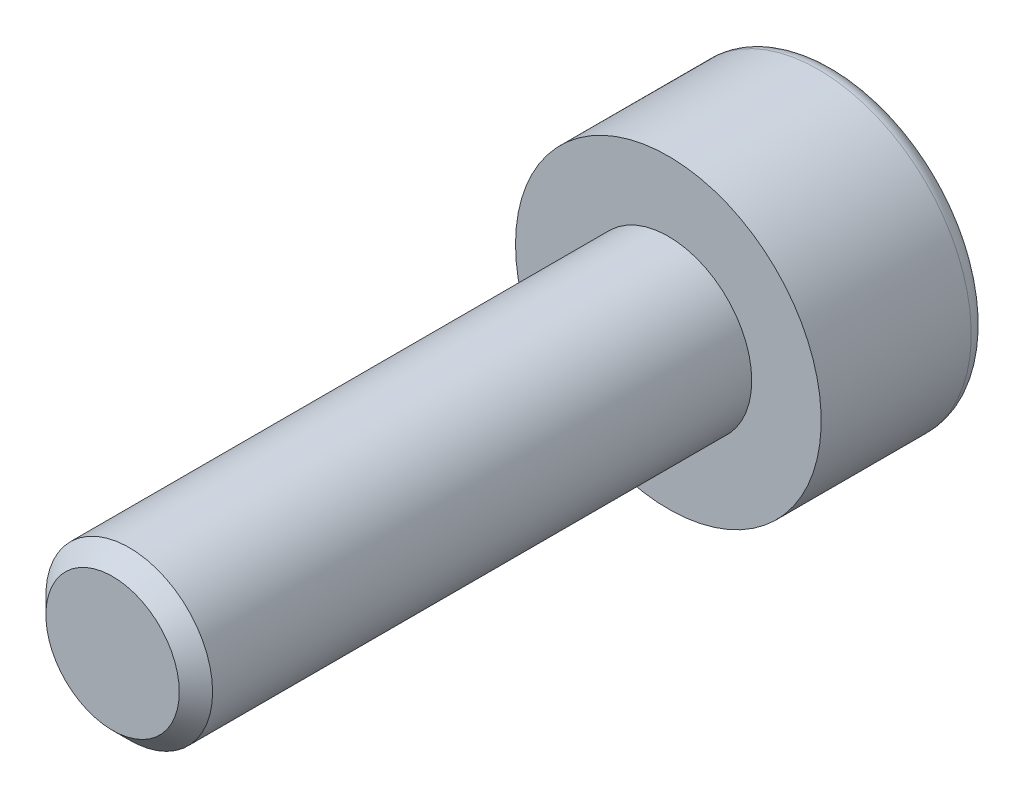
ISO-10303-21;
HEADER;
FILE_DESCRIPTION(('STEP AP214'),'2;1');
FILE_NAME('part.step','',(''),(''),'','','');
FILE_SCHEMA(('AUTOMOTIVE_DESIGN { 1 0 10303 214 1 1 1 1 }'));
ENDSEC;
DATA;
#1=APPLICATION_CONTEXT('core data for automotive mechanical design processes');
#2=APPLICATION_PROTOCOL_DEFINITION('international standard','automotive_design',2000,#1);
#3=PRODUCT_CONTEXT('',#1,'mechanical');
#4=PRODUCT('Part','Part','',(#3));
#5=PRODUCT_RELATED_PRODUCT_CATEGORY('part','',(#4));
#6=PRODUCT_DEFINITION_FORMATION('','',#4);
#7=PRODUCT_DEFINITION_CONTEXT('part definition',#1,'design');
#8=PRODUCT_DEFINITION('design','',#6,#7);
#9=PRODUCT_DEFINITION_SHAPE('','',#8);
#10=(LENGTH_UNIT() NAMED_UNIT(*) SI_UNIT(.MILLI.,.METRE.));
#11=(NAMED_UNIT(*) PLANE_ANGLE_UNIT() SI_UNIT($,.RADIAN.));
#12=(NAMED_UNIT(*) SI_UNIT($,.STERADIAN.) SOLID_ANGLE_UNIT());
#13=UNCERTAINTY_MEASURE_WITH_UNIT(LENGTH_MEASURE(1.E-05),#10,'distance_accuracy_value','');
#14=(GEOMETRIC_REPRESENTATION_CONTEXT(3) GLOBAL_UNCERTAINTY_ASSIGNED_CONTEXT((#13)) GLOBAL_UNIT_ASSIGNED_CONTEXT((#10,
#11,#12)) REPRESENTATION_CONTEXT('',''));
#15=CARTESIAN_POINT('',(0.,0.,0.));
#16=DIRECTION('',(0.,0.,1.));
#17=DIRECTION('',(1.,0.,0.));
#18=AXIS2_PLACEMENT_3D('',#15,#16,#17);
#19=CARTESIAN_POINT('',(0.,0.,-3.));
#20=DIRECTION('',(0.,0.,1.));
#21=DIRECTION('',(1.,0.,0.));
#22=AXIS2_PLACEMENT_3D('',#19,#20,#21);
#23=PLANE('',#22);
#24=CARTESIAN_POINT('',(0.,0.,-3.));
#25=DIRECTION('',(0.,0.,-1.));
#26=DIRECTION('',(-1.,0.,0.));
#27=AXIS2_PLACEMENT_3D('',#24,#25,#26);
#28=CIRCLE('',#27,2.45);
#29=CARTESIAN_POINT('',(-2.45,0.,-3.));
#30=VERTEX_POINT('',#29);
#31=EDGE_CURVE('E144',#30,#30,#28,.T.);
#32=ORIENTED_EDGE('',*,*,#31,.T.);
#33=EDGE_LOOP('',(#32));
#34=FACE_BOUND('',#33,.T.);
#35=DIRECTION('',(-0.86602540378444,0.499999999999998,0.));
#36=VECTOR('',#35,1.);
#37=CARTESIAN_POINT('',(0.,1.73205080756888,-3.));
#38=LINE('',#37,#36);
#39=CARTESIAN_POINT('',(1.5,0.866025403784442,-3.));
#40=VERTEX_POINT('',#39);
#41=CARTESIAN_POINT('',(0.,1.73205080756888,-3.));
#42=VERTEX_POINT('',#41);
#43=EDGE_CURVE('E46',#40,#42,#38,.T.);
#44=ORIENTED_EDGE('',*,*,#43,.T.);
#45=DIRECTION('',(-0.866025403784438,-0.500000000000001,0.));
#46=VECTOR('',#45,1.);
#47=CARTESIAN_POINT('',(0.,1.73205080756888,-3.));
#48=LINE('',#47,#46);
#49=CARTESIAN_POINT('',(-1.5,0.866025403784441,-3.));
#50=VERTEX_POINT('',#49);
#51=EDGE_CURVE('E117',#42,#50,#48,.T.);
#52=ORIENTED_EDGE('',*,*,#51,.T.);
#53=DIRECTION('',(0.,-1.,0.));
#54=VECTOR('',#53,1.);
#55=CARTESIAN_POINT('',(-1.5,-0.866025403784441,-3.));
#56=LINE('',#55,#54);
#57=CARTESIAN_POINT('',(-1.5,-0.866025403784441,-3.));
#58=VERTEX_POINT('',#57);
#59=EDGE_CURVE('E121',#50,#58,#56,.T.);
#60=ORIENTED_EDGE('',*,*,#59,.T.);
#61=DIRECTION('',(0.866025403784438,-0.500000000000001,0.));
#62=VECTOR('',#61,1.);
#63=CARTESIAN_POINT('',(0.,-1.73205080756888,-3.));
#64=LINE('',#63,#62);
#65=CARTESIAN_POINT('',(0.,-1.73205080756888,-3.));
#66=VERTEX_POINT('',#65);
#67=EDGE_CURVE('E124',#58,#66,#64,.T.);
#68=ORIENTED_EDGE('',*,*,#67,.T.);
#69=DIRECTION('',(0.86602540378444,0.499999999999998,0.));
#70=VECTOR('',#69,1.);
#71=CARTESIAN_POINT('',(0.,-1.73205080756888,-3.));
#72=LINE('',#71,#70);
#73=CARTESIAN_POINT('',(1.5,-0.866025403784441,-3.));
#74=VERTEX_POINT('',#73);
#75=EDGE_CURVE('E107',#66,#74,#72,.T.);
#76=ORIENTED_EDGE('',*,*,#75,.T.);
#77=DIRECTION('',(0.,1.,0.));
#78=VECTOR('',#77,1.);
#79=CARTESIAN_POINT('',(1.5,-0.866025403784441,-3.));
#80=LINE('',#79,#78);
#81=EDGE_CURVE('E127',#74,#40,#80,.T.);
#82=ORIENTED_EDGE('',*,*,#81,.T.);
#83=EDGE_LOOP('',(#44,#52,#60,#68,#76,#82));
#84=FACE_BOUND('',#83,.T.);
#85=ADVANCED_FACE('F31',(#34,#84),#23,.F.);
#86=CARTESIAN_POINT('',(0.,0.,-2.7));
#87=DIRECTION('',(0.,0.,-1.));
#88=DIRECTION('',(-1.,0.,0.));
#89=AXIS2_PLACEMENT_3D('',#86,#87,#88);
#90=TOROIDAL_SURFACE('',#89,2.45,0.3);
#91=ORIENTED_EDGE('',*,*,#31,.F.);
#92=EDGE_LOOP('',(#91));
#93=FACE_BOUND('',#92,.T.);
#94=CARTESIAN_POINT('',(0.,0.,-2.7));
#95=DIRECTION('',(0.,0.,-1.));
#96=DIRECTION('',(-1.,0.,0.));
#97=AXIS2_PLACEMENT_3D('',#94,#95,#96);
#98=CIRCLE('',#97,2.75);
#99=CARTESIAN_POINT('',(-2.75,0.,-2.7));
#100=VERTEX_POINT('',#99);
#101=EDGE_CURVE('E141',#100,#100,#98,.T.);
#102=ORIENTED_EDGE('',*,*,#101,.T.);
#103=EDGE_LOOP('',(#102));
#104=FACE_BOUND('',#103,.T.);
#105=ADVANCED_FACE('F161',(#93,#104),#90,.T.);
#106=CARTESIAN_POINT('',(0.,0.,0.));
#107=DIRECTION('',(0.,0.,-1.));
#108=DIRECTION('',(-1.,0.,0.));
#109=AXIS2_PLACEMENT_3D('',#106,#107,#108);
#110=CYLINDRICAL_SURFACE('',#109,2.75);
#111=ORIENTED_EDGE('',*,*,#101,.F.);
#112=EDGE_LOOP('',(#111));
#113=FACE_BOUND('',#112,.T.);
#114=CARTESIAN_POINT('',(0.,0.,0.));
#115=DIRECTION('',(0.,0.,-1.));
#116=DIRECTION('',(-1.,0.,0.));
#117=AXIS2_PLACEMENT_3D('',#114,#115,#116);
#118=CIRCLE('',#117,2.75);
#119=CARTESIAN_POINT('',(-2.75,0.,0.));
#120=VERTEX_POINT('',#119);
#121=EDGE_CURVE('E138',#120,#120,#118,.T.);
#122=ORIENTED_EDGE('',*,*,#121,.T.);
#123=EDGE_LOOP('',(#122));
#124=FACE_BOUND('',#123,.T.);
#125=ADVANCED_FACE('F166',(#113,#124),#110,.T.);
#126=CARTESIAN_POINT('',(0.,0.,0.));
#127=DIRECTION('',(0.,0.,-1.));
#128=DIRECTION('',(-1.,0.,0.));
#129=AXIS2_PLACEMENT_3D('',#126,#127,#128);
#130=PLANE('',#129);
#131=CARTESIAN_POINT('',(0.,0.,0.));
#132=DIRECTION('',(0.,0.,1.));
#133=DIRECTION('',(1.,0.,0.));
#134=AXIS2_PLACEMENT_3D('',#131,#132,#133);
#135=CIRCLE('',#134,1.5);
#136=CARTESIAN_POINT('',(1.5,0.,0.));
#137=VERTEX_POINT('',#136);
#138=EDGE_CURVE('E118',#137,#137,#135,.T.);
#139=ORIENTED_EDGE('',*,*,#138,.F.);
#140=EDGE_LOOP('',(#139));
#141=FACE_BOUND('',#140,.T.);
#142=ORIENTED_EDGE('',*,*,#121,.F.);
#143=EDGE_LOOP('',(#142));
#144=FACE_BOUND('',#143,.T.);
#145=ADVANCED_FACE('F173',(#141,#144),#130,.F.);
#146=CARTESIAN_POINT('',(0.,1.73205080756888,-1.));
#147=DIRECTION('',(-0.499999999999998,-0.86602540378444,0.));
#148=DIRECTION('',(0.86602540378444,-0.499999999999998,0.));
#149=AXIS2_PLACEMENT_3D('',#146,#147,#148);
#150=PLANE('',#149);
#151=ORIENTED_EDGE('',*,*,#43,.F.);
#152=DIRECTION('',(0.,0.,-1.));
#153=VECTOR('',#152,1.);
#154=CARTESIAN_POINT('',(1.5,0.866025403784442,-1.));
#155=LINE('',#154,#153);
#156=CARTESIAN_POINT('',(1.5,0.866025403784442,-1.));
#157=VERTEX_POINT('',#156);
#158=EDGE_CURVE('E112',#157,#40,#155,.T.);
#159=ORIENTED_EDGE('',*,*,#158,.F.);
#160=DIRECTION('',(-0.86602540378444,0.499999999999998,0.));
#161=VECTOR('',#160,1.);
#162=CARTESIAN_POINT('',(0.,1.73205080756888,-1.));
#163=LINE('',#162,#161);
#164=CARTESIAN_POINT('',(0.,1.73205080756888,-1.));
#165=VERTEX_POINT('',#164);
#166=EDGE_CURVE('E130',#157,#165,#163,.T.);
#167=ORIENTED_EDGE('',*,*,#166,.T.);
#168=DIRECTION('',(0.,0.,-1.));
#169=VECTOR('',#168,1.);
#170=CARTESIAN_POINT('',(0.,1.73205080756888,-1.));
#171=LINE('',#170,#169);
#172=EDGE_CURVE('E136',#165,#42,#171,.T.);
#173=ORIENTED_EDGE('',*,*,#172,.T.);
#174=EDGE_LOOP('',(#151,#159,#167,#173));
#175=FACE_BOUND('',#174,.T.);
#176=ADVANCED_FACE('F177',(#175),#150,.T.);
#177=CARTESIAN_POINT('',(0.,1.73205080756888,-1.));
#178=DIRECTION('',(0.500000000000001,-0.866025403784438,0.));
#179=DIRECTION('',(0.866025403784438,0.500000000000001,0.));
#180=AXIS2_PLACEMENT_3D('',#177,#178,#179);
#181=PLANE('',#180);
#182=ORIENTED_EDGE('',*,*,#51,.F.);
#183=ORIENTED_EDGE('',*,*,#172,.F.);
#184=DIRECTION('',(-0.866025403784438,-0.500000000000001,0.));
#185=VECTOR('',#184,1.);
#186=CARTESIAN_POINT('',(0.,1.73205080756888,-1.));
#187=LINE('',#186,#185);
#188=CARTESIAN_POINT('',(-1.5,0.866025403784441,-1.));
#189=VERTEX_POINT('',#188);
#190=EDGE_CURVE('E85',#165,#189,#187,.T.);
#191=ORIENTED_EDGE('',*,*,#190,.T.);
#192=DIRECTION('',(0.,0.,-1.));
#193=VECTOR('',#192,1.);
#194=CARTESIAN_POINT('',(-1.5,0.866025403784441,-1.));
#195=LINE('',#194,#193);
#196=EDGE_CURVE('E134',#189,#50,#195,.T.);
#197=ORIENTED_EDGE('',*,*,#196,.T.);
#198=EDGE_LOOP('',(#182,#183,#191,#197));
#199=FACE_BOUND('',#198,.T.);
#200=ADVANCED_FACE('F181',(#199),#181,.T.);
#201=CARTESIAN_POINT('',(-1.5,-0.866025403784441,-1.));
#202=DIRECTION('',(1.,0.,0.));
#203=DIRECTION('',(0.,0.,-1.));
#204=AXIS2_PLACEMENT_3D('',#201,#202,#203);
#205=PLANE('',#204);
#206=ORIENTED_EDGE('',*,*,#59,.F.);
#207=ORIENTED_EDGE('',*,*,#196,.F.);
#208=DIRECTION('',(0.,-1.,0.));
#209=VECTOR('',#208,1.);
#210=CARTESIAN_POINT('',(-1.5,-0.866025403784441,-1.));
#211=LINE('',#210,#209);
#212=CARTESIAN_POINT('',(-1.5,-0.866025403784441,-1.));
#213=VERTEX_POINT('',#212);
#214=EDGE_CURVE('E103',#189,#213,#211,.T.);
#215=ORIENTED_EDGE('',*,*,#214,.T.);
#216=DIRECTION('',(0.,0.,-1.));
#217=VECTOR('',#216,1.);
#218=CARTESIAN_POINT('',(-1.5,-0.866025403784441,-1.));
#219=LINE('',#218,#217);
#220=EDGE_CURVE('E100',#213,#58,#219,.T.);
#221=ORIENTED_EDGE('',*,*,#220,.T.);
#222=EDGE_LOOP('',(#206,#207,#215,#221));
#223=FACE_BOUND('',#222,.T.);
#224=ADVANCED_FACE('F184',(#223),#205,.T.);
#225=CARTESIAN_POINT('',(0.,-1.73205080756888,-1.));
#226=DIRECTION('',(0.500000000000001,0.866025403784438,0.));
#227=DIRECTION('',(-0.866025403784438,0.500000000000001,0.));
#228=AXIS2_PLACEMENT_3D('',#225,#226,#227);
#229=PLANE('',#228);
#230=ORIENTED_EDGE('',*,*,#67,.F.);
#231=ORIENTED_EDGE('',*,*,#220,.F.);
#232=DIRECTION('',(0.866025403784438,-0.500000000000001,0.));
#233=VECTOR('',#232,1.);
#234=CARTESIAN_POINT('',(0.,-1.73205080756888,-1.));
#235=LINE('',#234,#233);
#236=CARTESIAN_POINT('',(0.,-1.73205080756888,-1.));
#237=VERTEX_POINT('',#236);
#238=EDGE_CURVE('E95',#213,#237,#235,.T.);
#239=ORIENTED_EDGE('',*,*,#238,.T.);
#240=DIRECTION('',(0.,0.,-1.));
#241=VECTOR('',#240,1.);
#242=CARTESIAN_POINT('',(0.,-1.73205080756888,-1.));
#243=LINE('',#242,#241);
#244=EDGE_CURVE('E99',#237,#66,#243,.T.);
#245=ORIENTED_EDGE('',*,*,#244,.T.);
#246=EDGE_LOOP('',(#230,#231,#239,#245));
#247=FACE_BOUND('',#246,.T.);
#248=ADVANCED_FACE('F98',(#247),#229,.T.);
#249=CARTESIAN_POINT('',(0.,-1.73205080756888,-1.));
#250=DIRECTION('',(-0.499999999999998,0.86602540378444,0.));
#251=DIRECTION('',(-0.86602540378444,-0.499999999999998,0.));
#252=AXIS2_PLACEMENT_3D('',#249,#250,#251);
#253=PLANE('',#252);
#254=ORIENTED_EDGE('',*,*,#75,.F.);
#255=ORIENTED_EDGE('',*,*,#244,.F.);
#256=DIRECTION('',(0.86602540378444,0.499999999999998,0.));
#257=VECTOR('',#256,1.);
#258=CARTESIAN_POINT('',(0.,-1.73205080756888,-1.));
#259=LINE('',#258,#257);
#260=CARTESIAN_POINT('',(1.5,-0.866025403784441,-1.));
#261=VERTEX_POINT('',#260);
#262=EDGE_CURVE('E102',#237,#261,#259,.T.);
#263=ORIENTED_EDGE('',*,*,#262,.T.);
#264=DIRECTION('',(0.,0.,-1.));
#265=VECTOR('',#264,1.);
#266=CARTESIAN_POINT('',(1.5,-0.866025403784441,-1.));
#267=LINE('',#266,#265);
#268=EDGE_CURVE('E76',#261,#74,#267,.T.);
#269=ORIENTED_EDGE('',*,*,#268,.T.);
#270=EDGE_LOOP('',(#254,#255,#263,#269));
#271=FACE_BOUND('',#270,.T.);
#272=ADVANCED_FACE('F105',(#271),#253,.T.);
#273=CARTESIAN_POINT('',(1.5,-0.866025403784441,-1.));
#274=DIRECTION('',(-1.,0.,0.));
#275=DIRECTION('',(0.,0.,1.));
#276=AXIS2_PLACEMENT_3D('',#273,#274,#275);
#277=PLANE('',#276);
#278=ORIENTED_EDGE('',*,*,#81,.F.);
#279=ORIENTED_EDGE('',*,*,#268,.F.);
#280=DIRECTION('',(0.,1.,0.));
#281=VECTOR('',#280,1.);
#282=CARTESIAN_POINT('',(1.5,-0.866025403784441,-1.));
#283=LINE('',#282,#281);
#284=EDGE_CURVE('E54',#261,#157,#283,.T.);
#285=ORIENTED_EDGE('',*,*,#284,.T.);
#286=ORIENTED_EDGE('',*,*,#158,.T.);
#287=EDGE_LOOP('',(#278,#279,#285,#286));
#288=FACE_BOUND('',#287,.T.);
#289=ADVANCED_FACE('F193',(#288),#277,.T.);
#290=CARTESIAN_POINT('',(1.5,0.866025403784442,-1.));
#291=DIRECTION('',(0.,0.,1.));
#292=DIRECTION('',(1.,0.,0.));
#293=AXIS2_PLACEMENT_3D('',#290,#291,#292);
#294=PLANE('',#293);
#295=ORIENTED_EDGE('',*,*,#166,.F.);
#296=ORIENTED_EDGE('',*,*,#284,.F.);
#297=ORIENTED_EDGE('',*,*,#262,.F.);
#298=ORIENTED_EDGE('',*,*,#238,.F.);
#299=ORIENTED_EDGE('',*,*,#214,.F.);
#300=ORIENTED_EDGE('',*,*,#190,.F.);
#301=EDGE_LOOP('',(#295,#296,#297,#298,#299,#300));
#302=FACE_BOUND('',#301,.T.);
#303=ADVANCED_FACE('F110',(#302),#294,.F.);
#304=CARTESIAN_POINT('',(0.,0.,10.));
#305=DIRECTION('',(0.,0.,1.));
#306=DIRECTION('',(1.,0.,0.));
#307=AXIS2_PLACEMENT_3D('',#304,#305,#306);
#308=PLANE('',#307);
#309=CARTESIAN_POINT('',(0.,0.,10.));
#310=DIRECTION('',(0.,0.,1.));
#311=DIRECTION('',(1.,0.,0.));
#312=AXIS2_PLACEMENT_3D('',#309,#310,#311);
#313=CIRCLE('',#312,1.2);
#314=CARTESIAN_POINT('',(1.2,0.,10.));
#315=VERTEX_POINT('',#314);
#316=EDGE_CURVE('E39',#315,#315,#313,.T.);
#317=ORIENTED_EDGE('',*,*,#316,.T.);
#318=EDGE_LOOP('',(#317));
#319=FACE_BOUND('',#318,.T.);
#320=ADVANCED_FACE('F149',(#319),#308,.T.);
#321=CARTESIAN_POINT('',(0.,0.,0.));
#322=DIRECTION('',(0.,0.,1.));
#323=DIRECTION('',(1.,0.,0.));
#324=AXIS2_PLACEMENT_3D('',#321,#322,#323);
#325=CYLINDRICAL_SURFACE('',#324,1.5);
#326=CARTESIAN_POINT('',(0.,0.,9.7));
#327=DIRECTION('',(0.,0.,1.));
#328=DIRECTION('',(1.,0.,0.));
#329=AXIS2_PLACEMENT_3D('',#326,#327,#328);
#330=CIRCLE('',#329,1.5);
#331=CARTESIAN_POINT('',(1.5,0.,9.7));
#332=VERTEX_POINT('',#331);
#333=EDGE_CURVE('E11',#332,#332,#330,.F.);
#334=ORIENTED_EDGE('',*,*,#333,.T.);
#335=EDGE_LOOP('',(#334));
#336=FACE_BOUND('',#335,.T.);
#337=ORIENTED_EDGE('',*,*,#138,.T.);
#338=EDGE_LOOP('',(#337));
#339=FACE_BOUND('',#338,.T.);
#340=ADVANCED_FACE('F152',(#336,#339),#325,.T.);
#341=CARTESIAN_POINT('',(0.,0.,10.));
#342=DIRECTION('',(0.,0.,-1.));
#343=DIRECTION('',(-1.,0.,0.));
#344=AXIS2_PLACEMENT_3D('',#341,#342,#343);
#345=CONICAL_SURFACE('',#344,1.2,0.785398163397448);
#346=ORIENTED_EDGE('',*,*,#333,.F.);
#347=EDGE_LOOP('',(#346));
#348=FACE_BOUND('',#347,.T.);
#349=ORIENTED_EDGE('',*,*,#316,.F.);
#350=EDGE_LOOP('',(#349));
#351=FACE_BOUND('',#350,.T.);
#352=ADVANCED_FACE('F33',(#348,#351),#345,.T.);
#353=CLOSED_SHELL('',(#85,#105,#125,#145,#176,#200,#224,#248,#272,#289,#303,#320,#340,#352));
#354=MANIFOLD_SOLID_BREP('B2',#353);
#355=ADVANCED_BREP_SHAPE_REPRESENTATION('',(#18,#354),#14);
#356=SHAPE_DEFINITION_REPRESENTATION(#9,#355);
ENDSEC;
END-ISO-10303-21;
